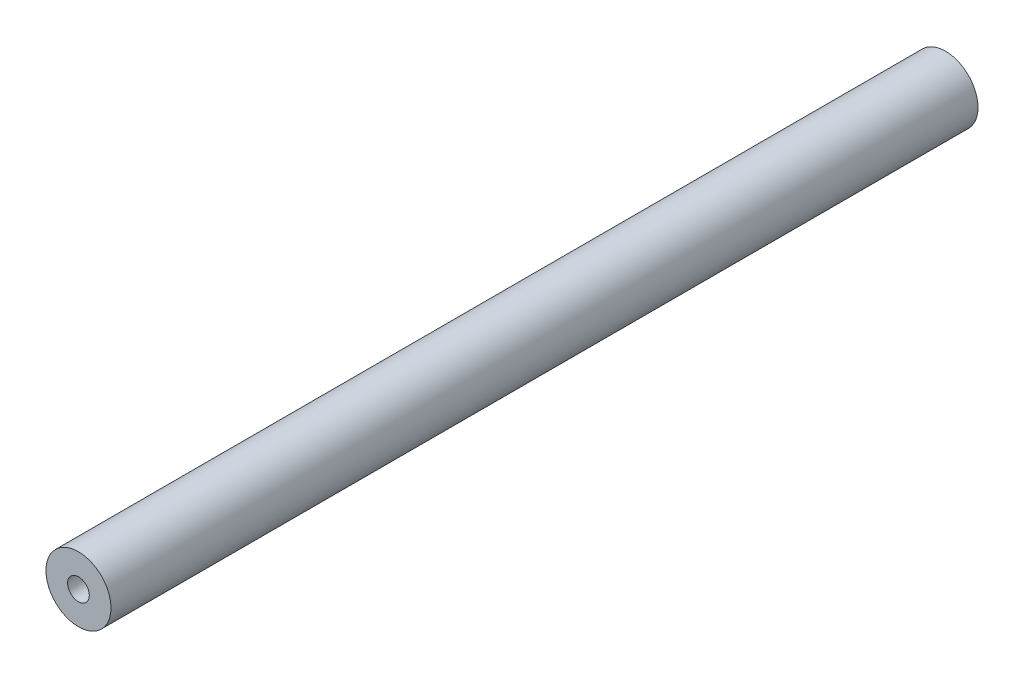
ISO-10303-21;
HEADER;
FILE_DESCRIPTION(('STEP AP214'),'2;1');
FILE_NAME('part.step','',(''),(''),'','','');
FILE_SCHEMA(('AUTOMOTIVE_DESIGN { 1 0 10303 214 1 1 1 1 }'));
ENDSEC;
DATA;
#1=APPLICATION_CONTEXT('core data for automotive mechanical design processes');
#2=APPLICATION_PROTOCOL_DEFINITION('international standard','automotive_design',2000,#1);
#3=PRODUCT_CONTEXT('',#1,'mechanical');
#4=PRODUCT('Part','Part','',(#3));
#5=PRODUCT_RELATED_PRODUCT_CATEGORY('part','',(#4));
#6=PRODUCT_DEFINITION_FORMATION('','',#4);
#7=PRODUCT_DEFINITION_CONTEXT('part definition',#1,'design');
#8=PRODUCT_DEFINITION('design','',#6,#7);
#9=PRODUCT_DEFINITION_SHAPE('','',#8);
#10=(LENGTH_UNIT() NAMED_UNIT(*) SI_UNIT(.MILLI.,.METRE.));
#11=(NAMED_UNIT(*) PLANE_ANGLE_UNIT() SI_UNIT($,.RADIAN.));
#12=(NAMED_UNIT(*) SI_UNIT($,.STERADIAN.) SOLID_ANGLE_UNIT());
#13=UNCERTAINTY_MEASURE_WITH_UNIT(LENGTH_MEASURE(1.E-05),#10,'distance_accuracy_value','');
#14=(GEOMETRIC_REPRESENTATION_CONTEXT(3) GLOBAL_UNCERTAINTY_ASSIGNED_CONTEXT((#13)) GLOBAL_UNIT_ASSIGNED_CONTEXT((#10,
#11,#12)) REPRESENTATION_CONTEXT('',''));
#15=CARTESIAN_POINT('',(0.,0.,0.));
#16=DIRECTION('',(0.,0.,1.));
#17=DIRECTION('',(1.,0.,0.));
#18=AXIS2_PLACEMENT_3D('',#15,#16,#17);
#19=CARTESIAN_POINT('',(0.,0.,0.));
#20=DIRECTION('',(0.,0.,1.));
#21=DIRECTION('',(1.,0.,0.));
#22=AXIS2_PLACEMENT_3D('',#19,#20,#21);
#23=CYLINDRICAL_SURFACE('',#22,0.5);
#24=CARTESIAN_POINT('',(0.,0.,0.));
#25=DIRECTION('',(0.,0.,1.));
#26=DIRECTION('',(1.,0.,0.));
#27=AXIS2_PLACEMENT_3D('',#24,#25,#26);
#28=CIRCLE('',#27,0.5);
#29=CARTESIAN_POINT('',(0.5,0.,0.));
#30=VERTEX_POINT('',#29);
#31=EDGE_CURVE('E27',#30,#30,#28,.T.);
#32=ORIENTED_EDGE('',*,*,#31,.F.);
#33=EDGE_LOOP('',(#32));
#34=FACE_BOUND('',#33,.T.);
#35=CARTESIAN_POINT('',(0.,0.,40.));
#36=DIRECTION('',(0.,0.,1.));
#37=DIRECTION('',(1.,0.,0.));
#38=AXIS2_PLACEMENT_3D('',#35,#36,#37);
#39=CIRCLE('',#38,0.5);
#40=CARTESIAN_POINT('',(0.5,0.,40.));
#41=VERTEX_POINT('',#40);
#42=EDGE_CURVE('E18',#41,#41,#39,.T.);
#43=ORIENTED_EDGE('',*,*,#42,.T.);
#44=EDGE_LOOP('',(#43));
#45=FACE_BOUND('',#44,.T.);
#46=ADVANCED_FACE('F15',(#34,#45),#23,.F.);
#47=CARTESIAN_POINT('',(0.,0.,40.));
#48=DIRECTION('',(0.,0.,-1.));
#49=DIRECTION('',(-1.,0.,0.));
#50=AXIS2_PLACEMENT_3D('',#47,#48,#49);
#51=PLANE('',#50);
#52=ORIENTED_EDGE('',*,*,#42,.F.);
#53=EDGE_LOOP('',(#52));
#54=FACE_BOUND('',#53,.T.);
#55=CARTESIAN_POINT('',(0.,0.,40.));
#56=DIRECTION('',(0.,0.,1.));
#57=DIRECTION('',(1.,0.,0.));
#58=AXIS2_PLACEMENT_3D('',#55,#56,#57);
#59=CIRCLE('',#58,1.5);
#60=CARTESIAN_POINT('',(1.5,0.,40.));
#61=VERTEX_POINT('',#60);
#62=EDGE_CURVE('E22',#61,#61,#59,.F.);
#63=ORIENTED_EDGE('',*,*,#62,.F.);
#64=EDGE_LOOP('',(#63));
#65=FACE_BOUND('',#64,.T.);
#66=ADVANCED_FACE('F36',(#54,#65),#51,.F.);
#67=CARTESIAN_POINT('',(0.,0.,0.));
#68=DIRECTION('',(0.,0.,-1.));
#69=DIRECTION('',(-1.,0.,0.));
#70=AXIS2_PLACEMENT_3D('',#67,#68,#69);
#71=PLANE('',#70);
#72=ORIENTED_EDGE('',*,*,#31,.T.);
#73=EDGE_LOOP('',(#72));
#74=FACE_BOUND('',#73,.T.);
#75=CARTESIAN_POINT('',(0.,0.,0.));
#76=DIRECTION('',(0.,0.,1.));
#77=DIRECTION('',(1.,0.,0.));
#78=AXIS2_PLACEMENT_3D('',#75,#76,#77);
#79=CIRCLE('',#78,1.5);
#80=CARTESIAN_POINT('',(1.5,0.,0.));
#81=VERTEX_POINT('',#80);
#82=EDGE_CURVE('E10',#81,#81,#79,.T.);
#83=ORIENTED_EDGE('',*,*,#82,.F.);
#84=EDGE_LOOP('',(#83));
#85=FACE_BOUND('',#84,.T.);
#86=ADVANCED_FACE('F39',(#74,#85),#71,.T.);
#87=CARTESIAN_POINT('',(0.,0.,0.));
#88=DIRECTION('',(0.,0.,1.));
#89=DIRECTION('',(1.,0.,0.));
#90=AXIS2_PLACEMENT_3D('',#87,#88,#89);
#91=CYLINDRICAL_SURFACE('',#90,1.5);
#92=ORIENTED_EDGE('',*,*,#82,.T.);
#93=EDGE_LOOP('',(#92));
#94=FACE_BOUND('',#93,.T.);
#95=ORIENTED_EDGE('',*,*,#62,.T.);
#96=EDGE_LOOP('',(#95));
#97=FACE_BOUND('',#96,.T.);
#98=ADVANCED_FACE('F42',(#94,#97),#91,.T.);
#99=CLOSED_SHELL('',(#46,#66,#86,#98));
#100=MANIFOLD_SOLID_BREP('B1',#99);
#101=ADVANCED_BREP_SHAPE_REPRESENTATION('',(#18,#100),#14);
#102=SHAPE_DEFINITION_REPRESENTATION(#9,#101);
ENDSEC;
END-ISO-10303-21;
